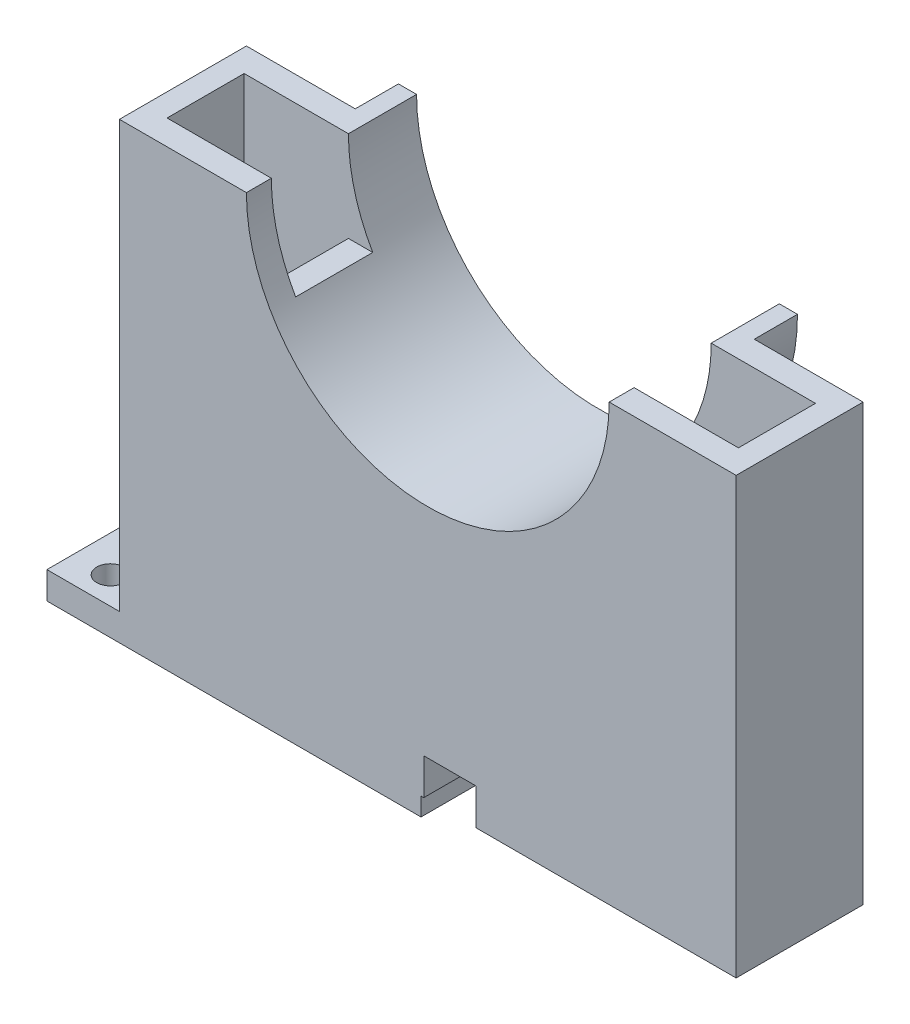
ISO-10303-21;
HEADER;
FILE_DESCRIPTION(('STEP AP214'),'2;1');
FILE_NAME('part.step','',(''),(''),'','','');
FILE_SCHEMA(('AUTOMOTIVE_DESIGN { 1 0 10303 214 1 1 1 1 }'));
ENDSEC;
DATA;
#1=APPLICATION_CONTEXT('core data for automotive mechanical design processes');
#2=APPLICATION_PROTOCOL_DEFINITION('international standard','automotive_design',2000,#1);
#3=PRODUCT_CONTEXT('',#1,'mechanical');
#4=PRODUCT('Part','Part','',(#3));
#5=PRODUCT_RELATED_PRODUCT_CATEGORY('part','',(#4));
#6=PRODUCT_DEFINITION_FORMATION('','',#4);
#7=PRODUCT_DEFINITION_CONTEXT('part definition',#1,'design');
#8=PRODUCT_DEFINITION('design','',#6,#7);
#9=PRODUCT_DEFINITION_SHAPE('','',#8);
#10=(LENGTH_UNIT() NAMED_UNIT(*) SI_UNIT(.MILLI.,.METRE.));
#11=(NAMED_UNIT(*) PLANE_ANGLE_UNIT() SI_UNIT($,.RADIAN.));
#12=(NAMED_UNIT(*) SI_UNIT($,.STERADIAN.) SOLID_ANGLE_UNIT());
#13=UNCERTAINTY_MEASURE_WITH_UNIT(LENGTH_MEASURE(1.E-05),#10,'distance_accuracy_value','');
#14=(GEOMETRIC_REPRESENTATION_CONTEXT(3) GLOBAL_UNCERTAINTY_ASSIGNED_CONTEXT((#13)) GLOBAL_UNIT_ASSIGNED_CONTEXT((#10,
#11,#12)) REPRESENTATION_CONTEXT('',''));
#15=CARTESIAN_POINT('',(0.,0.,0.));
#16=DIRECTION('',(0.,0.,1.));
#17=DIRECTION('',(1.,0.,0.));
#18=AXIS2_PLACEMENT_3D('',#15,#16,#17);
#19=CARTESIAN_POINT('',(76.,2.,48.8025146361581));
#20=DIRECTION('',(0.,1.,0.));
#21=DIRECTION('',(0.,0.,1.));
#22=AXIS2_PLACEMENT_3D('',#19,#20,#21);
#23=PLANE('',#22);
#24=DIRECTION('',(1.,0.,0.));
#25=VECTOR('',#24,1.);
#26=CARTESIAN_POINT('',(76.,2.,0.));
#27=LINE('',#26,#25);
#28=CARTESIAN_POINT('',(41.255,2.,0.));
#29=VERTEX_POINT('',#28);
#30=CARTESIAN_POINT('',(41.555,2.,0.));
#31=VERTEX_POINT('',#30);
#32=EDGE_CURVE('E297',#29,#31,#27,.T.);
#33=ORIENTED_EDGE('',*,*,#32,.T.);
#34=DIRECTION('',(0.,0.,1.));
#35=VECTOR('',#34,1.);
#36=CARTESIAN_POINT('',(41.555,2.,-7.00446286306096));
#37=LINE('',#36,#35);
#38=CARTESIAN_POINT('',(41.555,2.,14.));
#39=VERTEX_POINT('',#38);
#40=EDGE_CURVE('E282',#31,#39,#37,.T.);
#41=ORIENTED_EDGE('',*,*,#40,.T.);
#42=DIRECTION('',(-1.,0.,0.));
#43=VECTOR('',#42,1.);
#44=CARTESIAN_POINT('',(76.,2.,14.));
#45=LINE('',#44,#43);
#46=CARTESIAN_POINT('',(41.255,2.,14.));
#47=VERTEX_POINT('',#46);
#48=EDGE_CURVE('E293',#39,#47,#45,.T.);
#49=ORIENTED_EDGE('',*,*,#48,.T.);
#50=DIRECTION('',(0.,0.,-1.));
#51=VECTOR('',#50,1.);
#52=CARTESIAN_POINT('',(41.255,2.,48.8025146361581));
#53=LINE('',#52,#51);
#54=EDGE_CURVE('E304',#47,#29,#53,.T.);
#55=ORIENTED_EDGE('',*,*,#54,.T.);
#56=EDGE_LOOP('',(#33,#41,#49,#55));
#57=FACE_BOUND('',#56,.T.);
#58=ADVANCED_FACE('F39',(#57),#23,.F.);
#59=CARTESIAN_POINT('',(22.,64.3003496460751,11.25));
#60=DIRECTION('',(1.,0.,0.));
#61=DIRECTION('',(0.,0.,-1.));
#62=AXIS2_PLACEMENT_3D('',#59,#60,#61);
#63=PLANE('',#62);
#64=DIRECTION('',(0.,0.,1.));
#65=VECTOR('',#64,1.);
#66=CARTESIAN_POINT('',(22.,40.,11.25));
#67=LINE('',#66,#65);
#68=CARTESIAN_POINT('',(22.,40.,2.75));
#69=VERTEX_POINT('',#68);
#70=CARTESIAN_POINT('',(22.,40.,11.25));
#71=VERTEX_POINT('',#70);
#72=EDGE_CURVE('E325',#69,#71,#67,.T.);
#73=ORIENTED_EDGE('',*,*,#72,.F.);
#74=DIRECTION('',(0.,-1.,0.));
#75=VECTOR('',#74,1.);
#76=CARTESIAN_POINT('',(22.,64.3003496460751,2.75));
#77=LINE('',#76,#75);
#78=CARTESIAN_POINT('',(22.,0.,2.75));
#79=VERTEX_POINT('',#78);
#80=EDGE_CURVE('E375',#69,#79,#77,.T.);
#81=ORIENTED_EDGE('',*,*,#80,.T.);
#82=DIRECTION('',(0.,0.,1.));
#83=VECTOR('',#82,1.);
#84=CARTESIAN_POINT('',(22.,0.,11.25));
#85=LINE('',#84,#83);
#86=CARTESIAN_POINT('',(22.,0.,11.25));
#87=VERTEX_POINT('',#86);
#88=EDGE_CURVE('E345',#79,#87,#85,.T.);
#89=ORIENTED_EDGE('',*,*,#88,.T.);
#90=DIRECTION('',(0.,-1.,0.));
#91=VECTOR('',#90,1.);
#92=CARTESIAN_POINT('',(22.,64.3003496460751,11.25));
#93=LINE('',#92,#91);
#94=EDGE_CURVE('E388',#71,#87,#93,.T.);
#95=ORIENTED_EDGE('',*,*,#94,.F.);
#96=EDGE_LOOP('',(#73,#81,#89,#95));
#97=FACE_BOUND('',#96,.T.);
#98=ADVANCED_FACE('F540',(#97),#63,.F.);
#99=CARTESIAN_POINT('',(62.,64.3003496460751,11.25));
#100=DIRECTION('',(-1.,0.,0.));
#101=DIRECTION('',(0.,0.,1.));
#102=AXIS2_PLACEMENT_3D('',#99,#100,#101);
#103=PLANE('',#102);
#104=DIRECTION('',(0.,-1.,0.));
#105=VECTOR('',#104,1.);
#106=CARTESIAN_POINT('',(62.,64.3003496460751,11.25));
#107=LINE('',#106,#105);
#108=CARTESIAN_POINT('',(62.,40.,11.25));
#109=VERTEX_POINT('',#108);
#110=CARTESIAN_POINT('',(62.,2.,11.25));
#111=VERTEX_POINT('',#110);
#112=EDGE_CURVE('E363',#109,#111,#107,.T.);
#113=ORIENTED_EDGE('',*,*,#112,.T.);
#114=DIRECTION('',(0.,0.,-1.));
#115=VECTOR('',#114,1.);
#116=CARTESIAN_POINT('',(62.,2.,11.25));
#117=LINE('',#116,#115);
#118=CARTESIAN_POINT('',(62.,2.,2.75));
#119=VERTEX_POINT('',#118);
#120=EDGE_CURVE('E311',#111,#119,#117,.T.);
#121=ORIENTED_EDGE('',*,*,#120,.T.);
#122=DIRECTION('',(0.,-1.,0.));
#123=VECTOR('',#122,1.);
#124=CARTESIAN_POINT('',(62.,64.3003496460751,2.75));
#125=LINE('',#124,#123);
#126=CARTESIAN_POINT('',(62.,40.,2.75));
#127=VERTEX_POINT('',#126);
#128=EDGE_CURVE('E360',#127,#119,#125,.T.);
#129=ORIENTED_EDGE('',*,*,#128,.F.);
#130=DIRECTION('',(0.,0.,-1.));
#131=VECTOR('',#130,1.);
#132=CARTESIAN_POINT('',(62.,40.,11.25));
#133=LINE('',#132,#131);
#134=EDGE_CURVE('E323',#109,#127,#133,.T.);
#135=ORIENTED_EDGE('',*,*,#134,.F.);
#136=EDGE_LOOP('',(#113,#121,#129,#135));
#137=FACE_BOUND('',#136,.T.);
#138=ADVANCED_FACE('F543',(#137),#103,.F.);
#139=CARTESIAN_POINT('',(0.,0.,14.));
#140=DIRECTION('',(0.,1.,0.));
#141=DIRECTION('',(0.,0.,1.));
#142=AXIS2_PLACEMENT_3D('',#139,#140,#141);
#143=PLANE('',#142);
#144=CARTESIAN_POINT('',(4.,0.,3.));
#145=DIRECTION('',(0.,1.,0.));
#146=DIRECTION('',(0.,0.,1.));
#147=AXIS2_PLACEMENT_3D('',#144,#145,#146);
#148=CIRCLE('',#147,1.5);
#149=CARTESIAN_POINT('',(4.,0.,4.5));
#150=VERTEX_POINT('',#149);
#151=EDGE_CURVE('E341',#150,#150,#148,.F.);
#152=ORIENTED_EDGE('',*,*,#151,.F.);
#153=EDGE_LOOP('',(#152));
#154=FACE_BOUND('',#153,.T.);
#155=CARTESIAN_POINT('',(4.,0.,11.));
#156=DIRECTION('',(0.,1.,0.));
#157=DIRECTION('',(0.,0.,1.));
#158=AXIS2_PLACEMENT_3D('',#155,#156,#157);
#159=CIRCLE('',#158,1.5);
#160=CARTESIAN_POINT('',(4.,0.,12.5));
#161=VERTEX_POINT('',#160);
#162=EDGE_CURVE('E342',#161,#161,#159,.F.);
#163=ORIENTED_EDGE('',*,*,#162,.F.);
#164=EDGE_LOOP('',(#163));
#165=FACE_BOUND('',#164,.T.);
#166=DIRECTION('',(-1.,0.,0.));
#167=VECTOR('',#166,1.);
#168=CARTESIAN_POINT('',(10.5,0.,11.25));
#169=LINE('',#168,#167);
#170=CARTESIAN_POINT('',(10.5,0.,11.25));
#171=VERTEX_POINT('',#170);
#172=EDGE_CURVE('E379',#87,#171,#169,.T.);
#173=ORIENTED_EDGE('',*,*,#172,.F.);
#174=ORIENTED_EDGE('',*,*,#88,.F.);
#175=DIRECTION('',(1.,0.,0.));
#176=VECTOR('',#175,1.);
#177=CARTESIAN_POINT('',(22.,0.,2.75));
#178=LINE('',#177,#176);
#179=CARTESIAN_POINT('',(10.5,0.,2.75));
#180=VERTEX_POINT('',#179);
#181=EDGE_CURVE('E385',#180,#79,#178,.T.);
#182=ORIENTED_EDGE('',*,*,#181,.F.);
#183=DIRECTION('',(0.,0.,-1.));
#184=VECTOR('',#183,1.);
#185=CARTESIAN_POINT('',(10.5,0.,2.75));
#186=LINE('',#185,#184);
#187=EDGE_CURVE('E382',#171,#180,#186,.T.);
#188=ORIENTED_EDGE('',*,*,#187,.F.);
#189=EDGE_LOOP('',(#173,#174,#182,#188));
#190=FACE_BOUND('',#189,.T.);
#191=DIRECTION('',(1.,0.,0.));
#192=VECTOR('',#191,1.);
#193=CARTESIAN_POINT('',(0.,0.,0.));
#194=LINE('',#193,#192);
#195=CARTESIAN_POINT('',(0.,0.,0.));
#196=VERTEX_POINT('',#195);
#197=CARTESIAN_POINT('',(41.255,0.,0.));
#198=VERTEX_POINT('',#197);
#199=EDGE_CURVE('E371',#196,#198,#194,.T.);
#200=ORIENTED_EDGE('',*,*,#199,.T.);
#201=DIRECTION('',(0.,0.,-1.));
#202=VECTOR('',#201,1.);
#203=CARTESIAN_POINT('',(41.255,0.,48.8025146361581));
#204=LINE('',#203,#202);
#205=CARTESIAN_POINT('',(41.255,0.,14.));
#206=VERTEX_POINT('',#205);
#207=EDGE_CURVE('E300',#206,#198,#204,.T.);
#208=ORIENTED_EDGE('',*,*,#207,.F.);
#209=DIRECTION('',(1.,0.,0.));
#210=VECTOR('',#209,1.);
#211=CARTESIAN_POINT('',(0.,0.,14.));
#212=LINE('',#211,#210);
#213=CARTESIAN_POINT('',(0.,0.,14.));
#214=VERTEX_POINT('',#213);
#215=EDGE_CURVE('E397',#214,#206,#212,.T.);
#216=ORIENTED_EDGE('',*,*,#215,.F.);
#217=DIRECTION('',(0.,0.,-1.));
#218=VECTOR('',#217,1.);
#219=CARTESIAN_POINT('',(0.,0.,14.));
#220=LINE('',#219,#218);
#221=EDGE_CURVE('E415',#214,#196,#220,.T.);
#222=ORIENTED_EDGE('',*,*,#221,.T.);
#223=EDGE_LOOP('',(#200,#208,#216,#222));
#224=FACE_BOUND('',#223,.T.);
#225=ADVANCED_FACE('F41',(#154,#165,#190,#224),#143,.F.);
#226=CARTESIAN_POINT('',(76.,0.,14.));
#227=DIRECTION('',(-1.,0.,0.));
#228=DIRECTION('',(0.,-1.,0.));
#229=AXIS2_PLACEMENT_3D('',#226,#227,#228);
#230=PLANE('',#229);
#231=DIRECTION('',(0.,1.,0.));
#232=VECTOR('',#231,1.);
#233=CARTESIAN_POINT('',(76.,0.,14.));
#234=LINE('',#233,#232);
#235=CARTESIAN_POINT('',(76.,2.,14.));
#236=VERTEX_POINT('',#235);
#237=CARTESIAN_POINT('',(76.,50.,14.));
#238=VERTEX_POINT('',#237);
#239=EDGE_CURVE('E400',#236,#238,#234,.T.);
#240=ORIENTED_EDGE('',*,*,#239,.F.);
#241=DIRECTION('',(0.,0.,-1.));
#242=VECTOR('',#241,1.);
#243=CARTESIAN_POINT('',(76.,2.,48.8025146361581));
#244=LINE('',#243,#242);
#245=CARTESIAN_POINT('',(76.,2.,0.));
#246=VERTEX_POINT('',#245);
#247=EDGE_CURVE('E301',#236,#246,#244,.T.);
#248=ORIENTED_EDGE('',*,*,#247,.T.);
#249=DIRECTION('',(0.,1.,0.));
#250=VECTOR('',#249,1.);
#251=CARTESIAN_POINT('',(76.,0.,0.));
#252=LINE('',#251,#250);
#253=CARTESIAN_POINT('',(76.,50.,0.));
#254=VERTEX_POINT('',#253);
#255=EDGE_CURVE('E418',#246,#254,#252,.T.);
#256=ORIENTED_EDGE('',*,*,#255,.T.);
#257=DIRECTION('',(0.,0.,-1.));
#258=VECTOR('',#257,1.);
#259=CARTESIAN_POINT('',(76.,50.,14.));
#260=LINE('',#259,#258);
#261=EDGE_CURVE('E47',#238,#254,#260,.T.);
#262=ORIENTED_EDGE('',*,*,#261,.F.);
#263=EDGE_LOOP('',(#240,#248,#256,#262));
#264=FACE_BOUND('',#263,.T.);
#265=ADVANCED_FACE('F453',(#264),#230,.F.);
#266=CARTESIAN_POINT('',(76.,50.,14.));
#267=DIRECTION('',(0.,-1.,0.));
#268=DIRECTION('',(0.,0.,-1.));
#269=AXIS2_PLACEMENT_3D('',#266,#267,#268);
#270=PLANE('',#269);
#271=DIRECTION('',(0.,0.,-1.));
#272=VECTOR('',#271,1.);
#273=CARTESIAN_POINT('',(62.,50.,14.));
#274=LINE('',#273,#272);
#275=CARTESIAN_POINT('',(62.,50.,2.75));
#276=VERTEX_POINT('',#275);
#277=CARTESIAN_POINT('',(62.,50.,-4.7625));
#278=VERTEX_POINT('',#277);
#279=EDGE_CURVE('E251',#276,#278,#274,.T.);
#280=ORIENTED_EDGE('',*,*,#279,.F.);
#281=DIRECTION('',(-1.,0.,0.));
#282=VECTOR('',#281,1.);
#283=CARTESIAN_POINT('',(62.,50.,2.75));
#284=LINE('',#283,#282);
#285=CARTESIAN_POINT('',(73.5,50.,2.75));
#286=VERTEX_POINT('',#285);
#287=EDGE_CURVE('E351',#286,#276,#284,.T.);
#288=ORIENTED_EDGE('',*,*,#287,.F.);
#289=DIRECTION('',(0.,0.,-1.));
#290=VECTOR('',#289,1.);
#291=CARTESIAN_POINT('',(73.5,50.,2.75));
#292=LINE('',#291,#290);
#293=CARTESIAN_POINT('',(73.5,50.,11.25));
#294=VERTEX_POINT('',#293);
#295=EDGE_CURVE('E354',#294,#286,#292,.T.);
#296=ORIENTED_EDGE('',*,*,#295,.F.);
#297=DIRECTION('',(1.,0.,0.));
#298=VECTOR('',#297,1.);
#299=CARTESIAN_POINT('',(73.5,50.,11.25));
#300=LINE('',#299,#298);
#301=CARTESIAN_POINT('',(62.,50.,11.25));
#302=VERTEX_POINT('',#301);
#303=EDGE_CURVE('E357',#302,#294,#300,.T.);
#304=ORIENTED_EDGE('',*,*,#303,.F.);
#305=CARTESIAN_POINT('',(62.,50.,14.));
#306=VERTEX_POINT('',#305);
#307=EDGE_CURVE('E440',#306,#302,#274,.T.);
#308=ORIENTED_EDGE('',*,*,#307,.F.);
#309=DIRECTION('',(-1.,0.,0.));
#310=VECTOR('',#309,1.);
#311=CARTESIAN_POINT('',(76.,50.,14.));
#312=LINE('',#311,#310);
#313=EDGE_CURVE('E403',#238,#306,#312,.T.);
#314=ORIENTED_EDGE('',*,*,#313,.F.);
#315=ORIENTED_EDGE('',*,*,#261,.T.);
#316=DIRECTION('',(-1.,0.,0.));
#317=VECTOR('',#316,1.);
#318=CARTESIAN_POINT('',(76.,50.,0.));
#319=LINE('',#318,#317);
#320=CARTESIAN_POINT('',(64.,50.,0.));
#321=VERTEX_POINT('',#320);
#322=EDGE_CURVE('E420',#254,#321,#319,.T.);
#323=ORIENTED_EDGE('',*,*,#322,.T.);
#324=DIRECTION('',(0.,0.,1.));
#325=VECTOR('',#324,1.);
#326=CARTESIAN_POINT('',(64.,50.,-4.7625));
#327=LINE('',#326,#325);
#328=CARTESIAN_POINT('',(64.,50.,-4.7625));
#329=VERTEX_POINT('',#328);
#330=EDGE_CURVE('E260',#329,#321,#327,.T.);
#331=ORIENTED_EDGE('',*,*,#330,.F.);
#332=DIRECTION('',(1.,0.,0.));
#333=VECTOR('',#332,1.);
#334=CARTESIAN_POINT('',(42.,50.,-4.7625));
#335=LINE('',#334,#333);
#336=EDGE_CURVE('E257',#278,#329,#335,.T.);
#337=ORIENTED_EDGE('',*,*,#336,.F.);
#338=EDGE_LOOP('',(#280,#288,#296,#304,#308,#314,#315,#323,#331,#337));
#339=FACE_BOUND('',#338,.T.);
#340=ADVANCED_FACE('F445',(#339),#270,.F.);
#341=CARTESIAN_POINT('',(42.,50.,14.));
#342=DIRECTION('',(0.,0.,-1.));
#343=DIRECTION('',(-1.,0.,0.));
#344=AXIS2_PLACEMENT_3D('',#341,#342,#343);
#345=CYLINDRICAL_SURFACE('',#344,20.);
#346=ORIENTED_EDGE('',*,*,#307,.T.);
#347=CARTESIAN_POINT('',(42.,50.,11.25));
#348=DIRECTION('',(0.,0.,1.));
#349=DIRECTION('',(1.,0.,0.));
#350=AXIS2_PLACEMENT_3D('',#347,#348,#349);
#351=CIRCLE('',#350,20.);
#352=CARTESIAN_POINT('',(59.3205080756888,40.,11.25));
#353=VERTEX_POINT('',#352);
#354=EDGE_CURVE('E334',#302,#353,#351,.F.);
#355=ORIENTED_EDGE('',*,*,#354,.T.);
#356=DIRECTION('',(0.,0.,-1.));
#357=VECTOR('',#356,1.);
#358=CARTESIAN_POINT('',(59.3205080756888,40.,14.));
#359=LINE('',#358,#357);
#360=CARTESIAN_POINT('',(59.3205080756888,40.,2.75));
#361=VERTEX_POINT('',#360);
#362=EDGE_CURVE('E329',#361,#353,#359,.F.);
#363=ORIENTED_EDGE('',*,*,#362,.F.);
#364=CARTESIAN_POINT('',(42.,50.,2.75));
#365=DIRECTION('',(0.,0.,-1.));
#366=DIRECTION('',(-1.,0.,0.));
#367=AXIS2_PLACEMENT_3D('',#364,#365,#366);
#368=CIRCLE('',#367,20.);
#369=EDGE_CURVE('E331',#361,#276,#368,.F.);
#370=ORIENTED_EDGE('',*,*,#369,.T.);
#371=ORIENTED_EDGE('',*,*,#279,.T.);
#372=CARTESIAN_POINT('',(42.,50.,-4.7625));
#373=DIRECTION('',(0.,0.,-1.));
#374=DIRECTION('',(-1.,0.,0.));
#375=AXIS2_PLACEMENT_3D('',#372,#373,#374);
#376=CIRCLE('',#375,20.);
#377=CARTESIAN_POINT('',(22.,50.,-4.7625));
#378=VERTEX_POINT('',#377);
#379=EDGE_CURVE('E243',#278,#378,#376,.T.);
#380=ORIENTED_EDGE('',*,*,#379,.T.);
#381=DIRECTION('',(0.,0.,-1.));
#382=VECTOR('',#381,1.);
#383=CARTESIAN_POINT('',(22.,50.,14.));
#384=LINE('',#383,#382);
#385=CARTESIAN_POINT('',(22.,50.,2.75));
#386=VERTEX_POINT('',#385);
#387=EDGE_CURVE('E227',#386,#378,#384,.T.);
#388=ORIENTED_EDGE('',*,*,#387,.F.);
#389=CARTESIAN_POINT('',(24.6794919243112,40.,2.75));
#390=VERTEX_POINT('',#389);
#391=EDGE_CURVE('E333',#386,#390,#368,.F.);
#392=ORIENTED_EDGE('',*,*,#391,.T.);
#393=DIRECTION('',(0.,0.,-1.));
#394=VECTOR('',#393,1.);
#395=CARTESIAN_POINT('',(24.6794919243112,40.,14.));
#396=LINE('',#395,#394);
#397=CARTESIAN_POINT('',(24.6794919243112,40.,11.25));
#398=VERTEX_POINT('',#397);
#399=EDGE_CURVE('E327',#398,#390,#396,.T.);
#400=ORIENTED_EDGE('',*,*,#399,.F.);
#401=CARTESIAN_POINT('',(22.,50.,11.25));
#402=VERTEX_POINT('',#401);
#403=EDGE_CURVE('E337',#398,#402,#351,.F.);
#404=ORIENTED_EDGE('',*,*,#403,.T.);
#405=CARTESIAN_POINT('',(22.,50.,14.));
#406=VERTEX_POINT('',#405);
#407=EDGE_CURVE('E237',#406,#402,#384,.T.);
#408=ORIENTED_EDGE('',*,*,#407,.F.);
#409=CARTESIAN_POINT('',(42.,50.,14.));
#410=DIRECTION('',(0.,0.,-1.));
#411=DIRECTION('',(-1.,0.,0.));
#412=AXIS2_PLACEMENT_3D('',#409,#410,#411);
#413=CIRCLE('',#412,20.);
#414=EDGE_CURVE('E405',#306,#406,#413,.T.);
#415=ORIENTED_EDGE('',*,*,#414,.F.);
#416=EDGE_LOOP('',(#346,#355,#363,#370,#371,#380,#388,#392,#400,#404,#408,#415));
#417=FACE_BOUND('',#416,.T.);
#418=ADVANCED_FACE('F249',(#417),#345,.F.);
#419=CARTESIAN_POINT('',(8.,50.,14.));
#420=DIRECTION('',(0.,-1.,0.));
#421=DIRECTION('',(0.,0.,-1.));
#422=AXIS2_PLACEMENT_3D('',#419,#420,#421);
#423=PLANE('',#422);
#424=DIRECTION('',(0.,0.,1.));
#425=VECTOR('',#424,1.);
#426=CARTESIAN_POINT('',(10.5,50.,2.75));
#427=LINE('',#426,#425);
#428=CARTESIAN_POINT('',(10.5,50.,2.75));
#429=VERTEX_POINT('',#428);
#430=CARTESIAN_POINT('',(10.5,50.,11.25));
#431=VERTEX_POINT('',#430);
#432=EDGE_CURVE('E372',#429,#431,#427,.T.);
#433=ORIENTED_EDGE('',*,*,#432,.F.);
#434=DIRECTION('',(-1.,0.,0.));
#435=VECTOR('',#434,1.);
#436=CARTESIAN_POINT('',(22.,50.,2.75));
#437=LINE('',#436,#435);
#438=EDGE_CURVE('E233',#386,#429,#437,.T.);
#439=ORIENTED_EDGE('',*,*,#438,.F.);
#440=ORIENTED_EDGE('',*,*,#387,.T.);
#441=DIRECTION('',(1.,0.,0.));
#442=VECTOR('',#441,1.);
#443=CARTESIAN_POINT('',(42.,50.,-4.7625));
#444=LINE('',#443,#442);
#445=CARTESIAN_POINT('',(20.,50.,-4.7625));
#446=VERTEX_POINT('',#445);
#447=EDGE_CURVE('E232',#446,#378,#444,.T.);
#448=ORIENTED_EDGE('',*,*,#447,.F.);
#449=DIRECTION('',(0.,0.,1.));
#450=VECTOR('',#449,1.);
#451=CARTESIAN_POINT('',(20.,50.,-4.7625));
#452=LINE('',#451,#450);
#453=CARTESIAN_POINT('',(20.,50.,0.));
#454=VERTEX_POINT('',#453);
#455=EDGE_CURVE('E258',#446,#454,#452,.T.);
#456=ORIENTED_EDGE('',*,*,#455,.T.);
#457=DIRECTION('',(-1.,0.,0.));
#458=VECTOR('',#457,1.);
#459=CARTESIAN_POINT('',(8.,50.,0.));
#460=LINE('',#459,#458);
#461=CARTESIAN_POINT('',(8.,50.,0.));
#462=VERTEX_POINT('',#461);
#463=EDGE_CURVE('E422',#454,#462,#460,.T.);
#464=ORIENTED_EDGE('',*,*,#463,.T.);
#465=DIRECTION('',(0.,0.,-1.));
#466=VECTOR('',#465,1.);
#467=CARTESIAN_POINT('',(8.,50.,14.));
#468=LINE('',#467,#466);
#469=CARTESIAN_POINT('',(8.,50.,14.));
#470=VERTEX_POINT('',#469);
#471=EDGE_CURVE('E238',#470,#462,#468,.T.);
#472=ORIENTED_EDGE('',*,*,#471,.F.);
#473=DIRECTION('',(-1.,0.,0.));
#474=VECTOR('',#473,1.);
#475=CARTESIAN_POINT('',(8.,50.,14.));
#476=LINE('',#475,#474);
#477=EDGE_CURVE('E407',#406,#470,#476,.T.);
#478=ORIENTED_EDGE('',*,*,#477,.F.);
#479=ORIENTED_EDGE('',*,*,#407,.T.);
#480=DIRECTION('',(1.,0.,0.));
#481=VECTOR('',#480,1.);
#482=CARTESIAN_POINT('',(10.5,50.,11.25));
#483=LINE('',#482,#481);
#484=EDGE_CURVE('E369',#431,#402,#483,.T.);
#485=ORIENTED_EDGE('',*,*,#484,.F.);
#486=EDGE_LOOP('',(#433,#439,#440,#448,#456,#464,#472,#478,#479,#485));
#487=FACE_BOUND('',#486,.T.);
#488=ADVANCED_FACE('F230',(#487),#423,.F.);
#489=CARTESIAN_POINT('',(8.,3.,14.));
#490=DIRECTION('',(1.,0.,0.));
#491=DIRECTION('',(0.,0.,-1.));
#492=AXIS2_PLACEMENT_3D('',#489,#490,#491);
#493=PLANE('',#492);
#494=DIRECTION('',(0.,-1.,0.));
#495=VECTOR('',#494,1.);
#496=CARTESIAN_POINT('',(8.,3.,0.));
#497=LINE('',#496,#495);
#498=CARTESIAN_POINT('',(8.,3.,0.));
#499=VERTEX_POINT('',#498);
#500=EDGE_CURVE('E424',#462,#499,#497,.T.);
#501=ORIENTED_EDGE('',*,*,#500,.T.);
#502=DIRECTION('',(0.,0.,-1.));
#503=VECTOR('',#502,1.);
#504=CARTESIAN_POINT('',(8.,3.,14.));
#505=LINE('',#504,#503);
#506=CARTESIAN_POINT('',(8.,3.,14.));
#507=VERTEX_POINT('',#506);
#508=EDGE_CURVE('E434',#507,#499,#505,.T.);
#509=ORIENTED_EDGE('',*,*,#508,.F.);
#510=DIRECTION('',(0.,-1.,0.));
#511=VECTOR('',#510,1.);
#512=CARTESIAN_POINT('',(8.,3.,14.));
#513=LINE('',#512,#511);
#514=EDGE_CURVE('E409',#470,#507,#513,.T.);
#515=ORIENTED_EDGE('',*,*,#514,.F.);
#516=ORIENTED_EDGE('',*,*,#471,.T.);
#517=EDGE_LOOP('',(#501,#509,#515,#516));
#518=FACE_BOUND('',#517,.T.);
#519=ADVANCED_FACE('F495',(#518),#493,.F.);
#520=CARTESIAN_POINT('',(0.,3.,14.));
#521=DIRECTION('',(0.,-1.,0.));
#522=DIRECTION('',(0.,0.,-1.));
#523=AXIS2_PLACEMENT_3D('',#520,#521,#522);
#524=PLANE('',#523);
#525=CARTESIAN_POINT('',(4.,3.,3.));
#526=DIRECTION('',(0.,1.,0.));
#527=DIRECTION('',(0.,0.,1.));
#528=AXIS2_PLACEMENT_3D('',#525,#526,#527);
#529=CIRCLE('',#528,1.5);
#530=CARTESIAN_POINT('',(4.,3.,4.5));
#531=VERTEX_POINT('',#530);
#532=EDGE_CURVE('E338',#531,#531,#529,.T.);
#533=ORIENTED_EDGE('',*,*,#532,.F.);
#534=EDGE_LOOP('',(#533));
#535=FACE_BOUND('',#534,.T.);
#536=CARTESIAN_POINT('',(4.,3.,11.));
#537=DIRECTION('',(0.,1.,0.));
#538=DIRECTION('',(0.,0.,1.));
#539=AXIS2_PLACEMENT_3D('',#536,#537,#538);
#540=CIRCLE('',#539,1.5);
#541=CARTESIAN_POINT('',(4.,3.,12.5));
#542=VERTEX_POINT('',#541);
#543=EDGE_CURVE('E346',#542,#542,#540,.T.);
#544=ORIENTED_EDGE('',*,*,#543,.F.);
#545=EDGE_LOOP('',(#544));
#546=FACE_BOUND('',#545,.T.);
#547=DIRECTION('',(-1.,0.,0.));
#548=VECTOR('',#547,1.);
#549=CARTESIAN_POINT('',(0.,3.,0.));
#550=LINE('',#549,#548);
#551=CARTESIAN_POINT('',(0.,3.,0.));
#552=VERTEX_POINT('',#551);
#553=EDGE_CURVE('E426',#499,#552,#550,.T.);
#554=ORIENTED_EDGE('',*,*,#553,.T.);
#555=DIRECTION('',(0.,0.,-1.));
#556=VECTOR('',#555,1.);
#557=CARTESIAN_POINT('',(0.,3.,14.));
#558=LINE('',#557,#556);
#559=CARTESIAN_POINT('',(0.,3.,14.));
#560=VERTEX_POINT('',#559);
#561=EDGE_CURVE('E431',#560,#552,#558,.T.);
#562=ORIENTED_EDGE('',*,*,#561,.F.);
#563=DIRECTION('',(-1.,0.,0.));
#564=VECTOR('',#563,1.);
#565=CARTESIAN_POINT('',(0.,3.,14.));
#566=LINE('',#565,#564);
#567=EDGE_CURVE('E411',#507,#560,#566,.T.);
#568=ORIENTED_EDGE('',*,*,#567,.F.);
#569=ORIENTED_EDGE('',*,*,#508,.T.);
#570=EDGE_LOOP('',(#554,#562,#568,#569));
#571=FACE_BOUND('',#570,.T.);
#572=ADVANCED_FACE('F491',(#535,#546,#571),#524,.F.);
#573=CARTESIAN_POINT('',(0.,0.,14.));
#574=DIRECTION('',(1.,0.,0.));
#575=DIRECTION('',(0.,0.,-1.));
#576=AXIS2_PLACEMENT_3D('',#573,#574,#575);
#577=PLANE('',#576);
#578=DIRECTION('',(0.,-1.,0.));
#579=VECTOR('',#578,1.);
#580=CARTESIAN_POINT('',(0.,0.,0.));
#581=LINE('',#580,#579);
#582=EDGE_CURVE('E401',#552,#196,#581,.T.);
#583=ORIENTED_EDGE('',*,*,#582,.T.);
#584=ORIENTED_EDGE('',*,*,#221,.F.);
#585=DIRECTION('',(0.,-1.,0.));
#586=VECTOR('',#585,1.);
#587=CARTESIAN_POINT('',(0.,0.,14.));
#588=LINE('',#587,#586);
#589=EDGE_CURVE('E413',#560,#214,#588,.T.);
#590=ORIENTED_EDGE('',*,*,#589,.F.);
#591=ORIENTED_EDGE('',*,*,#561,.T.);
#592=EDGE_LOOP('',(#583,#584,#590,#591));
#593=FACE_BOUND('',#592,.T.);
#594=ADVANCED_FACE('F486',(#593),#577,.F.);
#595=CARTESIAN_POINT('',(42.,50.,14.));
#596=DIRECTION('',(0.,0.,-1.));
#597=DIRECTION('',(-1.,0.,0.));
#598=AXIS2_PLACEMENT_3D('',#595,#596,#597);
#599=PLANE('',#598);
#600=ORIENTED_EDGE('',*,*,#48,.F.);
#601=DIRECTION('',(0.,-1.,0.));
#602=VECTOR('',#601,1.);
#603=CARTESIAN_POINT('',(41.555,6.,14.));
#604=LINE('',#603,#602);
#605=CARTESIAN_POINT('',(41.555,6.,14.));
#606=VERTEX_POINT('',#605);
#607=EDGE_CURVE('E265',#606,#39,#604,.T.);
#608=ORIENTED_EDGE('',*,*,#607,.F.);
#609=DIRECTION('',(-1.,0.,0.));
#610=VECTOR('',#609,1.);
#611=CARTESIAN_POINT('',(47.305,6.,14.));
#612=LINE('',#611,#610);
#613=CARTESIAN_POINT('',(47.305,6.,14.));
#614=VERTEX_POINT('',#613);
#615=EDGE_CURVE('E268',#614,#606,#612,.T.);
#616=ORIENTED_EDGE('',*,*,#615,.F.);
#617=DIRECTION('',(0.,1.,0.));
#618=VECTOR('',#617,1.);
#619=CARTESIAN_POINT('',(47.305,2.,14.));
#620=LINE('',#619,#618);
#621=CARTESIAN_POINT('',(47.305,2.,14.));
#622=VERTEX_POINT('',#621);
#623=EDGE_CURVE('E263',#622,#614,#620,.T.);
#624=ORIENTED_EDGE('',*,*,#623,.F.);
#625=EDGE_CURVE('E289',#236,#622,#45,.T.);
#626=ORIENTED_EDGE('',*,*,#625,.F.);
#627=ORIENTED_EDGE('',*,*,#239,.T.);
#628=ORIENTED_EDGE('',*,*,#313,.T.);
#629=ORIENTED_EDGE('',*,*,#414,.T.);
#630=ORIENTED_EDGE('',*,*,#477,.T.);
#631=ORIENTED_EDGE('',*,*,#514,.T.);
#632=ORIENTED_EDGE('',*,*,#567,.T.);
#633=ORIENTED_EDGE('',*,*,#589,.T.);
#634=ORIENTED_EDGE('',*,*,#215,.T.);
#635=DIRECTION('',(0.,-1.,0.));
#636=VECTOR('',#635,1.);
#637=CARTESIAN_POINT('',(41.255,2.,14.));
#638=LINE('',#637,#636);
#639=EDGE_CURVE('E292',#47,#206,#638,.T.);
#640=ORIENTED_EDGE('',*,*,#639,.F.);
#641=EDGE_LOOP('',(#600,#608,#616,#624,#626,#627,#628,#629,#630,#631,#632,#633,#634,#640));
#642=FACE_BOUND('',#641,.T.);
#643=ADVANCED_FACE('F461',(#642),#599,.F.);
#644=CARTESIAN_POINT('',(42.,50.,0.));
#645=DIRECTION('',(0.,0.,-1.));
#646=DIRECTION('',(-1.,0.,0.));
#647=AXIS2_PLACEMENT_3D('',#644,#645,#646);
#648=PLANE('',#647);
#649=CARTESIAN_POINT('',(42.,50.,0.));
#650=DIRECTION('',(0.,0.,-1.));
#651=DIRECTION('',(-1.,0.,0.));
#652=AXIS2_PLACEMENT_3D('',#649,#650,#651);
#653=CIRCLE('',#652,22.);
#654=EDGE_CURVE('E54',#321,#454,#653,.T.);
#655=ORIENTED_EDGE('',*,*,#654,.F.);
#656=ORIENTED_EDGE('',*,*,#322,.F.);
#657=ORIENTED_EDGE('',*,*,#255,.F.);
#658=CARTESIAN_POINT('',(47.305,2.,0.));
#659=VERTEX_POINT('',#658);
#660=EDGE_CURVE('E296',#659,#246,#27,.T.);
#661=ORIENTED_EDGE('',*,*,#660,.F.);
#662=DIRECTION('',(0.,1.,0.));
#663=VECTOR('',#662,1.);
#664=CARTESIAN_POINT('',(47.305,2.,0.));
#665=LINE('',#664,#663);
#666=CARTESIAN_POINT('',(47.305,6.,0.));
#667=VERTEX_POINT('',#666);
#668=EDGE_CURVE('E62',#659,#667,#665,.T.);
#669=ORIENTED_EDGE('',*,*,#668,.T.);
#670=DIRECTION('',(-1.,0.,0.));
#671=VECTOR('',#670,1.);
#672=CARTESIAN_POINT('',(47.305,6.,0.));
#673=LINE('',#672,#671);
#674=CARTESIAN_POINT('',(41.555,6.,0.));
#675=VERTEX_POINT('',#674);
#676=EDGE_CURVE('E267',#667,#675,#673,.T.);
#677=ORIENTED_EDGE('',*,*,#676,.T.);
#678=DIRECTION('',(0.,-1.,0.));
#679=VECTOR('',#678,1.);
#680=CARTESIAN_POINT('',(41.555,6.,0.));
#681=LINE('',#680,#679);
#682=EDGE_CURVE('E279',#675,#31,#681,.T.);
#683=ORIENTED_EDGE('',*,*,#682,.T.);
#684=ORIENTED_EDGE('',*,*,#32,.F.);
#685=DIRECTION('',(0.,1.,0.));
#686=VECTOR('',#685,1.);
#687=CARTESIAN_POINT('',(41.255,2.,0.));
#688=LINE('',#687,#686);
#689=EDGE_CURVE('E288',#198,#29,#688,.T.);
#690=ORIENTED_EDGE('',*,*,#689,.F.);
#691=ORIENTED_EDGE('',*,*,#199,.F.);
#692=ORIENTED_EDGE('',*,*,#582,.F.);
#693=ORIENTED_EDGE('',*,*,#553,.F.);
#694=ORIENTED_EDGE('',*,*,#500,.F.);
#695=ORIENTED_EDGE('',*,*,#463,.F.);
#696=EDGE_LOOP('',(#655,#656,#657,#661,#669,#677,#683,#684,#690,#691,#692,#693,#694,#695));
#697=FACE_BOUND('',#696,.T.);
#698=ADVANCED_FACE('F451',(#697),#648,.T.);
#699=CARTESIAN_POINT('',(22.,64.3003496460751,2.75));
#700=DIRECTION('',(0.,0.,-1.));
#701=DIRECTION('',(-1.,0.,0.));
#702=AXIS2_PLACEMENT_3D('',#699,#700,#701);
#703=PLANE('',#702);
#704=DIRECTION('',(0.,-1.,0.));
#705=VECTOR('',#704,1.);
#706=CARTESIAN_POINT('',(10.5,64.3003496460751,2.75));
#707=LINE('',#706,#705);
#708=EDGE_CURVE('E390',#429,#180,#707,.T.);
#709=ORIENTED_EDGE('',*,*,#708,.T.);
#710=ORIENTED_EDGE('',*,*,#181,.T.);
#711=ORIENTED_EDGE('',*,*,#80,.F.);
#712=DIRECTION('',(-1.,0.,0.));
#713=VECTOR('',#712,1.);
#714=CARTESIAN_POINT('',(10.5,40.,2.75));
#715=LINE('',#714,#713);
#716=EDGE_CURVE('E317',#390,#69,#715,.T.);
#717=ORIENTED_EDGE('',*,*,#716,.F.);
#718=ORIENTED_EDGE('',*,*,#391,.F.);
#719=ORIENTED_EDGE('',*,*,#438,.T.);
#720=EDGE_LOOP('',(#709,#710,#711,#717,#718,#719));
#721=FACE_BOUND('',#720,.T.);
#722=ADVANCED_FACE('F530',(#721),#703,.F.);
#723=CARTESIAN_POINT('',(10.5,64.3003496460751,2.75));
#724=DIRECTION('',(-1.,0.,0.));
#725=DIRECTION('',(0.,0.,1.));
#726=AXIS2_PLACEMENT_3D('',#723,#724,#725);
#727=PLANE('',#726);
#728=DIRECTION('',(0.,-1.,0.));
#729=VECTOR('',#728,1.);
#730=CARTESIAN_POINT('',(10.5,64.3003496460751,11.25));
#731=LINE('',#730,#729);
#732=EDGE_CURVE('E392',#431,#171,#731,.T.);
#733=ORIENTED_EDGE('',*,*,#732,.T.);
#734=ORIENTED_EDGE('',*,*,#187,.T.);
#735=ORIENTED_EDGE('',*,*,#708,.F.);
#736=ORIENTED_EDGE('',*,*,#432,.T.);
#737=EDGE_LOOP('',(#733,#734,#735,#736));
#738=FACE_BOUND('',#737,.T.);
#739=ADVANCED_FACE('F527',(#738),#727,.F.);
#740=CARTESIAN_POINT('',(10.5,64.3003496460751,11.25));
#741=DIRECTION('',(0.,0.,1.));
#742=DIRECTION('',(1.,0.,0.));
#743=AXIS2_PLACEMENT_3D('',#740,#741,#742);
#744=PLANE('',#743);
#745=ORIENTED_EDGE('',*,*,#484,.T.);
#746=ORIENTED_EDGE('',*,*,#403,.F.);
#747=DIRECTION('',(1.,0.,0.));
#748=VECTOR('',#747,1.);
#749=CARTESIAN_POINT('',(10.5,40.,11.25));
#750=LINE('',#749,#748);
#751=EDGE_CURVE('E322',#71,#398,#750,.T.);
#752=ORIENTED_EDGE('',*,*,#751,.F.);
#753=ORIENTED_EDGE('',*,*,#94,.T.);
#754=ORIENTED_EDGE('',*,*,#172,.T.);
#755=ORIENTED_EDGE('',*,*,#732,.F.);
#756=EDGE_LOOP('',(#745,#746,#752,#753,#754,#755));
#757=FACE_BOUND('',#756,.T.);
#758=ADVANCED_FACE('F520',(#757),#744,.F.);
#759=CARTESIAN_POINT('',(73.5,64.3003496460751,2.75));
#760=DIRECTION('',(1.,0.,0.));
#761=DIRECTION('',(0.,0.,-1.));
#762=AXIS2_PLACEMENT_3D('',#759,#760,#761);
#763=PLANE('',#762);
#764=DIRECTION('',(0.,-1.,0.));
#765=VECTOR('',#764,1.);
#766=CARTESIAN_POINT('',(73.5,64.3003496460751,2.75));
#767=LINE('',#766,#765);
#768=CARTESIAN_POINT('',(73.5,2.,2.75));
#769=VERTEX_POINT('',#768);
#770=EDGE_CURVE('E355',#286,#769,#767,.T.);
#771=ORIENTED_EDGE('',*,*,#770,.T.);
#772=DIRECTION('',(0.,0.,1.));
#773=VECTOR('',#772,1.);
#774=CARTESIAN_POINT('',(73.5,2.,2.75));
#775=LINE('',#774,#773);
#776=CARTESIAN_POINT('',(73.5,2.,11.25));
#777=VERTEX_POINT('',#776);
#778=EDGE_CURVE('E308',#769,#777,#775,.T.);
#779=ORIENTED_EDGE('',*,*,#778,.T.);
#780=DIRECTION('',(0.,-1.,0.));
#781=VECTOR('',#780,1.);
#782=CARTESIAN_POINT('',(73.5,64.3003496460751,11.25));
#783=LINE('',#782,#781);
#784=EDGE_CURVE('E366',#294,#777,#783,.T.);
#785=ORIENTED_EDGE('',*,*,#784,.F.);
#786=ORIENTED_EDGE('',*,*,#295,.T.);
#787=EDGE_LOOP('',(#771,#779,#785,#786));
#788=FACE_BOUND('',#787,.T.);
#789=ADVANCED_FACE('F508',(#788),#763,.F.);
#790=CARTESIAN_POINT('',(62.,64.3003496460751,2.75));
#791=DIRECTION('',(0.,0.,-1.));
#792=DIRECTION('',(-1.,0.,0.));
#793=AXIS2_PLACEMENT_3D('',#790,#791,#792);
#794=PLANE('',#793);
#795=ORIENTED_EDGE('',*,*,#128,.T.);
#796=DIRECTION('',(1.,0.,0.));
#797=VECTOR('',#796,1.);
#798=CARTESIAN_POINT('',(62.,2.,2.75));
#799=LINE('',#798,#797);
#800=EDGE_CURVE('E314',#119,#769,#799,.T.);
#801=ORIENTED_EDGE('',*,*,#800,.T.);
#802=ORIENTED_EDGE('',*,*,#770,.F.);
#803=ORIENTED_EDGE('',*,*,#287,.T.);
#804=ORIENTED_EDGE('',*,*,#369,.F.);
#805=EDGE_CURVE('E319',#127,#361,#715,.T.);
#806=ORIENTED_EDGE('',*,*,#805,.F.);
#807=EDGE_LOOP('',(#795,#801,#802,#803,#804,#806));
#808=FACE_BOUND('',#807,.T.);
#809=ADVANCED_FACE('F504',(#808),#794,.F.);
#810=CARTESIAN_POINT('',(73.5,64.3003496460751,11.25));
#811=DIRECTION('',(0.,0.,1.));
#812=DIRECTION('',(1.,0.,0.));
#813=AXIS2_PLACEMENT_3D('',#810,#811,#812);
#814=PLANE('',#813);
#815=ORIENTED_EDGE('',*,*,#784,.T.);
#816=DIRECTION('',(-1.,0.,0.));
#817=VECTOR('',#816,1.);
#818=CARTESIAN_POINT('',(73.5,2.,11.25));
#819=LINE('',#818,#817);
#820=EDGE_CURVE('E11',#777,#111,#819,.T.);
#821=ORIENTED_EDGE('',*,*,#820,.T.);
#822=ORIENTED_EDGE('',*,*,#112,.F.);
#823=EDGE_CURVE('E320',#353,#109,#750,.T.);
#824=ORIENTED_EDGE('',*,*,#823,.F.);
#825=ORIENTED_EDGE('',*,*,#354,.F.);
#826=ORIENTED_EDGE('',*,*,#303,.T.);
#827=EDGE_LOOP('',(#815,#821,#822,#824,#825,#826));
#828=FACE_BOUND('',#827,.T.);
#829=ADVANCED_FACE('F511',(#828),#814,.F.);
#830=CARTESIAN_POINT('',(4.,-4.24264068711929,11.));
#831=DIRECTION('',(0.,1.,0.));
#832=DIRECTION('',(0.,0.,1.));
#833=AXIS2_PLACEMENT_3D('',#830,#831,#832);
#834=CYLINDRICAL_SURFACE('',#833,1.5);
#835=ORIENTED_EDGE('',*,*,#162,.T.);
#836=EDGE_LOOP('',(#835));
#837=FACE_BOUND('',#836,.T.);
#838=ORIENTED_EDGE('',*,*,#543,.T.);
#839=EDGE_LOOP('',(#838));
#840=FACE_BOUND('',#839,.T.);
#841=ADVANCED_FACE('F576',(#837,#840),#834,.F.);
#842=CARTESIAN_POINT('',(4.,-4.24264068711929,3.));
#843=DIRECTION('',(0.,1.,0.));
#844=DIRECTION('',(0.,0.,1.));
#845=AXIS2_PLACEMENT_3D('',#842,#843,#844);
#846=CYLINDRICAL_SURFACE('',#845,1.5);
#847=ORIENTED_EDGE('',*,*,#151,.T.);
#848=EDGE_LOOP('',(#847));
#849=FACE_BOUND('',#848,.T.);
#850=ORIENTED_EDGE('',*,*,#532,.T.);
#851=EDGE_LOOP('',(#850));
#852=FACE_BOUND('',#851,.T.);
#853=ADVANCED_FACE('F571',(#849,#852),#846,.F.);
#854=CARTESIAN_POINT('',(0.,40.,0.));
#855=DIRECTION('',(0.,1.,0.));
#856=DIRECTION('',(0.,0.,1.));
#857=AXIS2_PLACEMENT_3D('',#854,#855,#856);
#858=PLANE('',#857);
#859=ORIENTED_EDGE('',*,*,#362,.T.);
#860=ORIENTED_EDGE('',*,*,#823,.T.);
#861=ORIENTED_EDGE('',*,*,#134,.T.);
#862=ORIENTED_EDGE('',*,*,#805,.T.);
#863=EDGE_LOOP('',(#859,#860,#861,#862));
#864=FACE_BOUND('',#863,.T.);
#865=ADVANCED_FACE('F566',(#864),#858,.T.);
#866=ORIENTED_EDGE('',*,*,#399,.T.);
#867=ORIENTED_EDGE('',*,*,#716,.T.);
#868=ORIENTED_EDGE('',*,*,#72,.T.);
#869=ORIENTED_EDGE('',*,*,#751,.T.);
#870=EDGE_LOOP('',(#866,#867,#868,#869));
#871=FACE_BOUND('',#870,.T.);
#872=ADVANCED_FACE('F536',(#871),#858,.T.);
#873=ORIENTED_EDGE('',*,*,#625,.T.);
#874=DIRECTION('',(0.,0.,1.));
#875=VECTOR('',#874,1.);
#876=CARTESIAN_POINT('',(47.305,2.,-7.00446286306096));
#877=LINE('',#876,#875);
#878=EDGE_CURVE('E278',#659,#622,#877,.T.);
#879=ORIENTED_EDGE('',*,*,#878,.F.);
#880=ORIENTED_EDGE('',*,*,#660,.T.);
#881=ORIENTED_EDGE('',*,*,#247,.F.);
#882=EDGE_LOOP('',(#873,#879,#880,#881));
#883=FACE_BOUND('',#882,.T.);
#884=ORIENTED_EDGE('',*,*,#120,.F.);
#885=ORIENTED_EDGE('',*,*,#820,.F.);
#886=ORIENTED_EDGE('',*,*,#778,.F.);
#887=ORIENTED_EDGE('',*,*,#800,.F.);
#888=EDGE_LOOP('',(#884,#885,#886,#887));
#889=FACE_BOUND('',#888,.T.);
#890=ADVANCED_FACE('F456',(#883,#889),#23,.F.);
#891=CARTESIAN_POINT('',(41.255,2.,48.8025146361581));
#892=DIRECTION('',(-1.,0.,0.));
#893=DIRECTION('',(0.,0.,1.));
#894=AXIS2_PLACEMENT_3D('',#891,#892,#893);
#895=PLANE('',#894);
#896=ORIENTED_EDGE('',*,*,#639,.T.);
#897=ORIENTED_EDGE('',*,*,#207,.T.);
#898=ORIENTED_EDGE('',*,*,#689,.T.);
#899=ORIENTED_EDGE('',*,*,#54,.F.);
#900=EDGE_LOOP('',(#896,#897,#898,#899));
#901=FACE_BOUND('',#900,.T.);
#902=ADVANCED_FACE('F477',(#901),#895,.F.);
#903=CARTESIAN_POINT('',(47.305,6.,-7.00446286306096));
#904=DIRECTION('',(0.,1.,0.));
#905=DIRECTION('',(-1.,0.,0.));
#906=AXIS2_PLACEMENT_3D('',#903,#904,#905);
#907=PLANE('',#906);
#908=DIRECTION('',(0.,0.,1.));
#909=VECTOR('',#908,1.);
#910=CARTESIAN_POINT('',(47.305,6.,-7.00446286306096));
#911=LINE('',#910,#909);
#912=EDGE_CURVE('E277',#667,#614,#911,.T.);
#913=ORIENTED_EDGE('',*,*,#912,.T.);
#914=ORIENTED_EDGE('',*,*,#615,.T.);
#915=DIRECTION('',(0.,0.,1.));
#916=VECTOR('',#915,1.);
#917=CARTESIAN_POINT('',(41.555,6.,-7.00446286306096));
#918=LINE('',#917,#916);
#919=EDGE_CURVE('E275',#675,#606,#918,.T.);
#920=ORIENTED_EDGE('',*,*,#919,.F.);
#921=ORIENTED_EDGE('',*,*,#676,.F.);
#922=EDGE_LOOP('',(#913,#914,#920,#921));
#923=FACE_BOUND('',#922,.T.);
#924=ADVANCED_FACE('F468',(#923),#907,.F.);
#925=CARTESIAN_POINT('',(41.555,6.,-7.00446286306096));
#926=DIRECTION('',(-1.,0.,0.));
#927=DIRECTION('',(0.,0.,1.));
#928=AXIS2_PLACEMENT_3D('',#925,#926,#927);
#929=PLANE('',#928);
#930=ORIENTED_EDGE('',*,*,#919,.T.);
#931=ORIENTED_EDGE('',*,*,#607,.T.);
#932=ORIENTED_EDGE('',*,*,#40,.F.);
#933=ORIENTED_EDGE('',*,*,#682,.F.);
#934=EDGE_LOOP('',(#930,#931,#932,#933));
#935=FACE_BOUND('',#934,.T.);
#936=ADVANCED_FACE('F470',(#935),#929,.F.);
#937=CARTESIAN_POINT('',(47.305,2.,-7.00446286306096));
#938=DIRECTION('',(1.,0.,0.));
#939=DIRECTION('',(0.,0.,-1.));
#940=AXIS2_PLACEMENT_3D('',#937,#938,#939);
#941=PLANE('',#940);
#942=ORIENTED_EDGE('',*,*,#878,.T.);
#943=ORIENTED_EDGE('',*,*,#623,.T.);
#944=ORIENTED_EDGE('',*,*,#912,.F.);
#945=ORIENTED_EDGE('',*,*,#668,.F.);
#946=EDGE_LOOP('',(#942,#943,#944,#945));
#947=FACE_BOUND('',#946,.T.);
#948=ADVANCED_FACE('F464',(#947),#941,.F.);
#949=CARTESIAN_POINT('',(42.,50.,-4.7625));
#950=DIRECTION('',(0.,0.,1.));
#951=DIRECTION('',(1.,0.,0.));
#952=AXIS2_PLACEMENT_3D('',#949,#950,#951);
#953=CYLINDRICAL_SURFACE('',#952,22.);
#954=ORIENTED_EDGE('',*,*,#654,.T.);
#955=ORIENTED_EDGE('',*,*,#455,.F.);
#956=CARTESIAN_POINT('',(42.,50.,-4.7625));
#957=DIRECTION('',(0.,0.,-1.));
#958=DIRECTION('',(-1.,0.,0.));
#959=AXIS2_PLACEMENT_3D('',#956,#957,#958);
#960=CIRCLE('',#959,22.);
#961=EDGE_CURVE('E245',#329,#446,#960,.T.);
#962=ORIENTED_EDGE('',*,*,#961,.F.);
#963=ORIENTED_EDGE('',*,*,#330,.T.);
#964=EDGE_LOOP('',(#954,#955,#962,#963));
#965=FACE_BOUND('',#964,.T.);
#966=ADVANCED_FACE('F498',(#965),#953,.T.);
#967=CARTESIAN_POINT('',(42.,50.,-4.7625));
#968=DIRECTION('',(0.,0.,-1.));
#969=DIRECTION('',(-1.,0.,0.));
#970=AXIS2_PLACEMENT_3D('',#967,#968,#969);
#971=PLANE('',#970);
#972=ORIENTED_EDGE('',*,*,#379,.F.);
#973=ORIENTED_EDGE('',*,*,#336,.T.);
#974=ORIENTED_EDGE('',*,*,#961,.T.);
#975=ORIENTED_EDGE('',*,*,#447,.T.);
#976=EDGE_LOOP('',(#972,#973,#974,#975));
#977=FACE_BOUND('',#976,.T.);
#978=ADVANCED_FACE('F242',(#977),#971,.T.);
#979=CLOSED_SHELL('',(#58,#98,#138,#225,#265,#340,#418,#488,#519,#572,#594,#643,#698,#722,#739,
#758,#789,#809,#829,#841,#853,#865,#872,#890,#902,#924,#936,#948,#966,#978));
#980=MANIFOLD_SOLID_BREP('B2',#979);
#981=ADVANCED_BREP_SHAPE_REPRESENTATION('',(#18,#980),#14);
#982=SHAPE_DEFINITION_REPRESENTATION(#9,#981);
ENDSEC;
END-ISO-10303-21;
